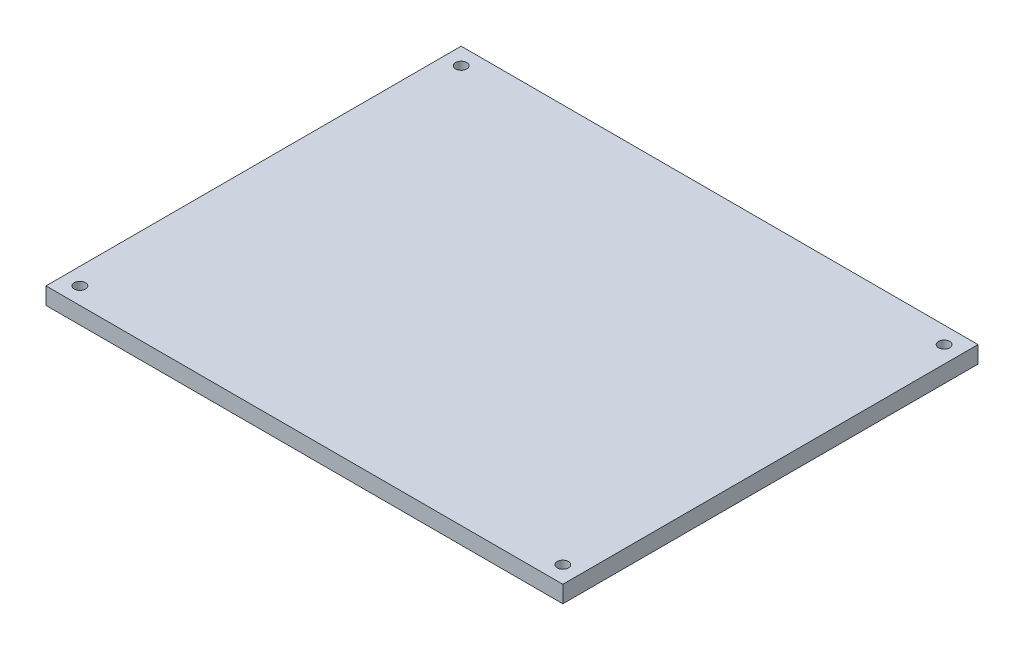
ISO-10303-21;
HEADER;
FILE_DESCRIPTION(('STEP AP214'),'2;1');
FILE_NAME('part.step','',(''),(''),'','','');
FILE_SCHEMA(('AUTOMOTIVE_DESIGN { 1 0 10303 214 1 1 1 1 }'));
ENDSEC;
DATA;
#1=APPLICATION_CONTEXT('core data for automotive mechanical design processes');
#2=APPLICATION_PROTOCOL_DEFINITION('international standard','automotive_design',2000,#1);
#3=PRODUCT_CONTEXT('',#1,'mechanical');
#4=PRODUCT('Part','Part','',(#3));
#5=PRODUCT_RELATED_PRODUCT_CATEGORY('part','',(#4));
#6=PRODUCT_DEFINITION_FORMATION('','',#4);
#7=PRODUCT_DEFINITION_CONTEXT('part definition',#1,'design');
#8=PRODUCT_DEFINITION('design','',#6,#7);
#9=PRODUCT_DEFINITION_SHAPE('','',#8);
#10=(LENGTH_UNIT() NAMED_UNIT(*) SI_UNIT(.MILLI.,.METRE.));
#11=(NAMED_UNIT(*) PLANE_ANGLE_UNIT() SI_UNIT($,.RADIAN.));
#12=(NAMED_UNIT(*) SI_UNIT($,.STERADIAN.) SOLID_ANGLE_UNIT());
#13=UNCERTAINTY_MEASURE_WITH_UNIT(LENGTH_MEASURE(1.E-05),#10,'distance_accuracy_value','');
#14=(GEOMETRIC_REPRESENTATION_CONTEXT(3) GLOBAL_UNCERTAINTY_ASSIGNED_CONTEXT((#13)) GLOBAL_UNIT_ASSIGNED_CONTEXT((#10,
#11,#12)) REPRESENTATION_CONTEXT('',''));
#15=CARTESIAN_POINT('',(0.,0.,0.));
#16=DIRECTION('',(0.,0.,1.));
#17=DIRECTION('',(1.,0.,0.));
#18=AXIS2_PLACEMENT_3D('',#15,#16,#17);
#19=CARTESIAN_POINT('',(265.,-10.,135.));
#20=DIRECTION('',(0.,0.,-1.));
#21=DIRECTION('',(-1.,0.,0.));
#22=AXIS2_PLACEMENT_3D('',#19,#20,#21);
#23=PLANE('',#22);
#24=DIRECTION('',(0.,-1.,0.));
#25=VECTOR('',#24,1.);
#26=CARTESIAN_POINT('',(-40.,-10.,135.));
#27=LINE('',#26,#25);
#28=CARTESIAN_POINT('',(-40.,0.,135.));
#29=VERTEX_POINT('',#28);
#30=CARTESIAN_POINT('',(-40.,-10.,135.));
#31=VERTEX_POINT('',#30);
#32=EDGE_CURVE('E107',#29,#31,#27,.T.);
#33=ORIENTED_EDGE('',*,*,#32,.T.);
#34=DIRECTION('',(-1.,0.,0.));
#35=VECTOR('',#34,1.);
#36=CARTESIAN_POINT('',(265.,-10.,135.));
#37=LINE('',#36,#35);
#38=CARTESIAN_POINT('',(265.,-10.,135.));
#39=VERTEX_POINT('',#38);
#40=EDGE_CURVE('E11',#39,#31,#37,.T.);
#41=ORIENTED_EDGE('',*,*,#40,.F.);
#42=DIRECTION('',(0.,-1.,0.));
#43=VECTOR('',#42,1.);
#44=CARTESIAN_POINT('',(265.,-10.,135.));
#45=LINE('',#44,#43);
#46=CARTESIAN_POINT('',(265.,0.,135.));
#47=VERTEX_POINT('',#46);
#48=EDGE_CURVE('E94',#47,#39,#45,.T.);
#49=ORIENTED_EDGE('',*,*,#48,.F.);
#50=DIRECTION('',(-1.,0.,0.));
#51=VECTOR('',#50,1.);
#52=CARTESIAN_POINT('',(265.,0.,135.));
#53=LINE('',#52,#51);
#54=EDGE_CURVE('E103',#47,#29,#53,.T.);
#55=ORIENTED_EDGE('',*,*,#54,.T.);
#56=EDGE_LOOP('',(#33,#41,#49,#55));
#57=FACE_BOUND('',#56,.T.);
#58=ADVANCED_FACE('F41',(#57),#23,.F.);
#59=CARTESIAN_POINT('',(265.,-10.,-110.));
#60=DIRECTION('',(0.,1.,0.));
#61=DIRECTION('',(0.,0.,1.));
#62=AXIS2_PLACEMENT_3D('',#59,#60,#61);
#63=PLANE('',#62);
#64=CARTESIAN_POINT('',(255.,-10.,125.));
#65=DIRECTION('',(0.,1.,0.));
#66=DIRECTION('',(0.,0.,1.));
#67=AXIS2_PLACEMENT_3D('',#64,#65,#66);
#68=CIRCLE('',#67,3.30000000000003);
#69=CARTESIAN_POINT('',(255.,-10.,128.3));
#70=VERTEX_POINT('',#69);
#71=EDGE_CURVE('E125',#70,#70,#68,.F.);
#72=ORIENTED_EDGE('',*,*,#71,.F.);
#73=EDGE_LOOP('',(#72));
#74=FACE_BOUND('',#73,.T.);
#75=CARTESIAN_POINT('',(255.,-10.,-100.));
#76=DIRECTION('',(0.,1.,0.));
#77=DIRECTION('',(0.,0.,1.));
#78=AXIS2_PLACEMENT_3D('',#75,#76,#77);
#79=CIRCLE('',#78,3.30000000000003);
#80=CARTESIAN_POINT('',(255.,-10.,-96.7));
#81=VERTEX_POINT('',#80);
#82=EDGE_CURVE('E122',#81,#81,#79,.F.);
#83=ORIENTED_EDGE('',*,*,#82,.F.);
#84=EDGE_LOOP('',(#83));
#85=FACE_BOUND('',#84,.T.);
#86=CARTESIAN_POINT('',(-30.,-10.,125.));
#87=DIRECTION('',(0.,1.,0.));
#88=DIRECTION('',(0.,0.,1.));
#89=AXIS2_PLACEMENT_3D('',#86,#87,#88);
#90=CIRCLE('',#89,3.3);
#91=CARTESIAN_POINT('',(-30.,-10.,128.3));
#92=VERTEX_POINT('',#91);
#93=EDGE_CURVE('E119',#92,#92,#90,.F.);
#94=ORIENTED_EDGE('',*,*,#93,.F.);
#95=EDGE_LOOP('',(#94));
#96=FACE_BOUND('',#95,.T.);
#97=CARTESIAN_POINT('',(-30.,-10.,-100.));
#98=DIRECTION('',(0.,1.,0.));
#99=DIRECTION('',(0.,0.,1.));
#100=AXIS2_PLACEMENT_3D('',#97,#98,#99);
#101=CIRCLE('',#100,3.3);
#102=CARTESIAN_POINT('',(-30.,-10.,-96.7));
#103=VERTEX_POINT('',#102);
#104=EDGE_CURVE('E110',#103,#103,#101,.F.);
#105=ORIENTED_EDGE('',*,*,#104,.F.);
#106=EDGE_LOOP('',(#105));
#107=FACE_BOUND('',#106,.T.);
#108=DIRECTION('',(0.,0.,-1.));
#109=VECTOR('',#108,1.);
#110=CARTESIAN_POINT('',(-40.,-10.,-110.));
#111=LINE('',#110,#109);
#112=CARTESIAN_POINT('',(-40.,-10.,-110.));
#113=VERTEX_POINT('',#112);
#114=EDGE_CURVE('E98',#31,#113,#111,.T.);
#115=ORIENTED_EDGE('',*,*,#114,.T.);
#116=DIRECTION('',(-1.,0.,0.));
#117=VECTOR('',#116,1.);
#118=CARTESIAN_POINT('',(265.,-10.,-110.));
#119=LINE('',#118,#117);
#120=CARTESIAN_POINT('',(265.,-10.,-110.));
#121=VERTEX_POINT('',#120);
#122=EDGE_CURVE('E50',#121,#113,#119,.T.);
#123=ORIENTED_EDGE('',*,*,#122,.F.);
#124=DIRECTION('',(0.,0.,-1.));
#125=VECTOR('',#124,1.);
#126=CARTESIAN_POINT('',(265.,-10.,-110.));
#127=LINE('',#126,#125);
#128=EDGE_CURVE('E89',#39,#121,#127,.T.);
#129=ORIENTED_EDGE('',*,*,#128,.F.);
#130=ORIENTED_EDGE('',*,*,#40,.T.);
#131=EDGE_LOOP('',(#115,#123,#129,#130));
#132=FACE_BOUND('',#131,.T.);
#133=ADVANCED_FACE('F97',(#74,#85,#96,#107,#132),#63,.F.);
#134=CARTESIAN_POINT('',(265.,-10.,-110.));
#135=DIRECTION('',(0.,0.,1.));
#136=DIRECTION('',(1.,0.,0.));
#137=AXIS2_PLACEMENT_3D('',#134,#135,#136);
#138=PLANE('',#137);
#139=DIRECTION('',(0.,1.,0.));
#140=VECTOR('',#139,1.);
#141=CARTESIAN_POINT('',(-40.,-10.,-110.));
#142=LINE('',#141,#140);
#143=CARTESIAN_POINT('',(-40.,0.,-110.));
#144=VERTEX_POINT('',#143);
#145=EDGE_CURVE('E76',#113,#144,#142,.T.);
#146=ORIENTED_EDGE('',*,*,#145,.T.);
#147=DIRECTION('',(-1.,0.,0.));
#148=VECTOR('',#147,1.);
#149=CARTESIAN_POINT('',(265.,0.,-110.));
#150=LINE('',#149,#148);
#151=CARTESIAN_POINT('',(265.,0.,-110.));
#152=VERTEX_POINT('',#151);
#153=EDGE_CURVE('E99',#152,#144,#150,.T.);
#154=ORIENTED_EDGE('',*,*,#153,.F.);
#155=DIRECTION('',(0.,1.,0.));
#156=VECTOR('',#155,1.);
#157=CARTESIAN_POINT('',(265.,-10.,-110.));
#158=LINE('',#157,#156);
#159=EDGE_CURVE('E92',#121,#152,#158,.T.);
#160=ORIENTED_EDGE('',*,*,#159,.F.);
#161=ORIENTED_EDGE('',*,*,#122,.T.);
#162=EDGE_LOOP('',(#146,#154,#160,#161));
#163=FACE_BOUND('',#162,.T.);
#164=ADVANCED_FACE('F101',(#163),#138,.F.);
#165=CARTESIAN_POINT('',(265.,0.,-110.));
#166=DIRECTION('',(0.,-1.,0.));
#167=DIRECTION('',(0.,0.,-1.));
#168=AXIS2_PLACEMENT_3D('',#165,#166,#167);
#169=PLANE('',#168);
#170=CARTESIAN_POINT('',(255.,0.,125.));
#171=DIRECTION('',(0.,-1.,0.));
#172=DIRECTION('',(0.,0.,-1.));
#173=AXIS2_PLACEMENT_3D('',#170,#171,#172);
#174=CIRCLE('',#173,3.30000000000003);
#175=CARTESIAN_POINT('',(255.,0.,121.7));
#176=VERTEX_POINT('',#175);
#177=EDGE_CURVE('E44',#176,#176,#174,.F.);
#178=ORIENTED_EDGE('',*,*,#177,.F.);
#179=EDGE_LOOP('',(#178));
#180=FACE_BOUND('',#179,.T.);
#181=CARTESIAN_POINT('',(255.,0.,-100.));
#182=DIRECTION('',(0.,-1.,0.));
#183=DIRECTION('',(0.,0.,-1.));
#184=AXIS2_PLACEMENT_3D('',#181,#182,#183);
#185=CIRCLE('',#184,3.30000000000003);
#186=CARTESIAN_POINT('',(255.,0.,-103.3));
#187=VERTEX_POINT('',#186);
#188=EDGE_CURVE('E123',#187,#187,#185,.F.);
#189=ORIENTED_EDGE('',*,*,#188,.F.);
#190=EDGE_LOOP('',(#189));
#191=FACE_BOUND('',#190,.T.);
#192=CARTESIAN_POINT('',(-30.,0.,125.));
#193=DIRECTION('',(0.,-1.,0.));
#194=DIRECTION('',(0.,0.,-1.));
#195=AXIS2_PLACEMENT_3D('',#192,#193,#194);
#196=CIRCLE('',#195,3.3);
#197=CARTESIAN_POINT('',(-30.,0.,121.7));
#198=VERTEX_POINT('',#197);
#199=EDGE_CURVE('E120',#198,#198,#196,.F.);
#200=ORIENTED_EDGE('',*,*,#199,.F.);
#201=EDGE_LOOP('',(#200));
#202=FACE_BOUND('',#201,.T.);
#203=CARTESIAN_POINT('',(-30.,0.,-100.));
#204=DIRECTION('',(0.,-1.,0.));
#205=DIRECTION('',(0.,0.,-1.));
#206=AXIS2_PLACEMENT_3D('',#203,#204,#205);
#207=CIRCLE('',#206,3.3);
#208=CARTESIAN_POINT('',(-30.,0.,-103.3));
#209=VERTEX_POINT('',#208);
#210=EDGE_CURVE('E116',#209,#209,#207,.F.);
#211=ORIENTED_EDGE('',*,*,#210,.F.);
#212=EDGE_LOOP('',(#211));
#213=FACE_BOUND('',#212,.T.);
#214=DIRECTION('',(0.,0.,1.));
#215=VECTOR('',#214,1.);
#216=CARTESIAN_POINT('',(-40.,0.,-110.));
#217=LINE('',#216,#215);
#218=EDGE_CURVE('E82',#144,#29,#217,.T.);
#219=ORIENTED_EDGE('',*,*,#218,.T.);
#220=ORIENTED_EDGE('',*,*,#54,.F.);
#221=DIRECTION('',(0.,0.,1.));
#222=VECTOR('',#221,1.);
#223=CARTESIAN_POINT('',(265.,0.,-110.));
#224=LINE('',#223,#222);
#225=EDGE_CURVE('E59',#152,#47,#224,.T.);
#226=ORIENTED_EDGE('',*,*,#225,.F.);
#227=ORIENTED_EDGE('',*,*,#153,.T.);
#228=EDGE_LOOP('',(#219,#220,#226,#227));
#229=FACE_BOUND('',#228,.T.);
#230=ADVANCED_FACE('F149',(#180,#191,#202,#213,#229),#169,.F.);
#231=CARTESIAN_POINT('',(265.,0.,0.));
#232=DIRECTION('',(1.,0.,0.));
#233=DIRECTION('',(0.,0.,-1.));
#234=AXIS2_PLACEMENT_3D('',#231,#232,#233);
#235=PLANE('',#234);
#236=ORIENTED_EDGE('',*,*,#48,.T.);
#237=ORIENTED_EDGE('',*,*,#128,.T.);
#238=ORIENTED_EDGE('',*,*,#159,.T.);
#239=ORIENTED_EDGE('',*,*,#225,.T.);
#240=EDGE_LOOP('',(#236,#237,#238,#239));
#241=FACE_BOUND('',#240,.T.);
#242=ADVANCED_FACE('F90',(#241),#235,.T.);
#243=CARTESIAN_POINT('',(-40.,0.,0.));
#244=DIRECTION('',(1.,0.,0.));
#245=DIRECTION('',(0.,0.,-1.));
#246=AXIS2_PLACEMENT_3D('',#243,#244,#245);
#247=PLANE('',#246);
#248=ORIENTED_EDGE('',*,*,#32,.F.);
#249=ORIENTED_EDGE('',*,*,#218,.F.);
#250=ORIENTED_EDGE('',*,*,#145,.F.);
#251=ORIENTED_EDGE('',*,*,#114,.F.);
#252=EDGE_LOOP('',(#248,#249,#250,#251));
#253=FACE_BOUND('',#252,.T.);
#254=ADVANCED_FACE('F157',(#253),#247,.F.);
#255=CARTESIAN_POINT('',(-30.,2.,-100.));
#256=DIRECTION('',(0.,-1.,0.));
#257=DIRECTION('',(0.,0.,-1.));
#258=AXIS2_PLACEMENT_3D('',#255,#256,#257);
#259=CYLINDRICAL_SURFACE('',#258,3.3);
#260=ORIENTED_EDGE('',*,*,#210,.T.);
#261=EDGE_LOOP('',(#260));
#262=FACE_BOUND('',#261,.T.);
#263=ORIENTED_EDGE('',*,*,#104,.T.);
#264=EDGE_LOOP('',(#263));
#265=FACE_BOUND('',#264,.T.);
#266=ADVANCED_FACE('F141',(#262,#265),#259,.F.);
#267=CARTESIAN_POINT('',(-30.,2.,125.));
#268=DIRECTION('',(0.,-1.,0.));
#269=DIRECTION('',(0.,0.,-1.));
#270=AXIS2_PLACEMENT_3D('',#267,#268,#269);
#271=CYLINDRICAL_SURFACE('',#270,3.3);
#272=ORIENTED_EDGE('',*,*,#199,.T.);
#273=EDGE_LOOP('',(#272));
#274=FACE_BOUND('',#273,.T.);
#275=ORIENTED_EDGE('',*,*,#93,.T.);
#276=EDGE_LOOP('',(#275));
#277=FACE_BOUND('',#276,.T.);
#278=ADVANCED_FACE('F165',(#274,#277),#271,.F.);
#279=CARTESIAN_POINT('',(255.,2.,-100.));
#280=DIRECTION('',(0.,-1.,0.));
#281=DIRECTION('',(0.,0.,-1.));
#282=AXIS2_PLACEMENT_3D('',#279,#280,#281);
#283=CYLINDRICAL_SURFACE('',#282,3.30000000000003);
#284=ORIENTED_EDGE('',*,*,#188,.T.);
#285=EDGE_LOOP('',(#284));
#286=FACE_BOUND('',#285,.T.);
#287=ORIENTED_EDGE('',*,*,#82,.T.);
#288=EDGE_LOOP('',(#287));
#289=FACE_BOUND('',#288,.T.);
#290=ADVANCED_FACE('F169',(#286,#289),#283,.F.);
#291=CARTESIAN_POINT('',(255.,2.,125.));
#292=DIRECTION('',(0.,-1.,0.));
#293=DIRECTION('',(0.,0.,-1.));
#294=AXIS2_PLACEMENT_3D('',#291,#292,#293);
#295=CYLINDRICAL_SURFACE('',#294,3.30000000000003);
#296=ORIENTED_EDGE('',*,*,#177,.T.);
#297=EDGE_LOOP('',(#296));
#298=FACE_BOUND('',#297,.T.);
#299=ORIENTED_EDGE('',*,*,#71,.T.);
#300=EDGE_LOOP('',(#299));
#301=FACE_BOUND('',#300,.T.);
#302=ADVANCED_FACE('F173',(#298,#301),#295,.F.);
#303=CLOSED_SHELL('',(#58,#133,#164,#230,#242,#254,#266,#278,#290,#302));
#304=MANIFOLD_SOLID_BREP('B2',#303);
#305=ADVANCED_BREP_SHAPE_REPRESENTATION('',(#18,#304),#14);
#306=SHAPE_DEFINITION_REPRESENTATION(#9,#305);
ENDSEC;
END-ISO-10303-21;
